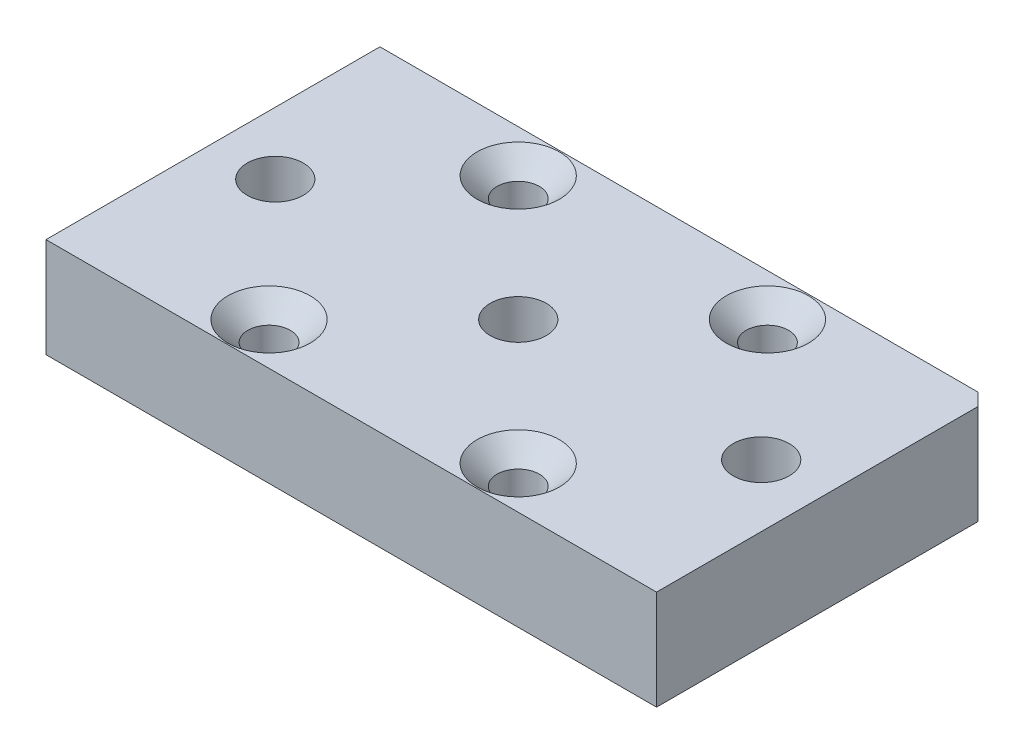
ISO-10303-21;
HEADER;
FILE_DESCRIPTION(('STEP AP214'),'2;1');
FILE_NAME('part.step','',(''),(''),'','','');
FILE_SCHEMA(('AUTOMOTIVE_DESIGN { 1 0 10303 214 1 1 1 1 }'));
ENDSEC;
DATA;
#1=APPLICATION_CONTEXT('core data for automotive mechanical design processes');
#2=APPLICATION_PROTOCOL_DEFINITION('international standard','automotive_design',2000,#1);
#3=PRODUCT_CONTEXT('',#1,'mechanical');
#4=PRODUCT('Part','Part','',(#3));
#5=PRODUCT_RELATED_PRODUCT_CATEGORY('part','',(#4));
#6=PRODUCT_DEFINITION_FORMATION('','',#4);
#7=PRODUCT_DEFINITION_CONTEXT('part definition',#1,'design');
#8=PRODUCT_DEFINITION('design','',#6,#7);
#9=PRODUCT_DEFINITION_SHAPE('','',#8);
#10=(LENGTH_UNIT() NAMED_UNIT(*) SI_UNIT(.MILLI.,.METRE.));
#11=(NAMED_UNIT(*) PLANE_ANGLE_UNIT() SI_UNIT($,.RADIAN.));
#12=(NAMED_UNIT(*) SI_UNIT($,.STERADIAN.) SOLID_ANGLE_UNIT());
#13=UNCERTAINTY_MEASURE_WITH_UNIT(LENGTH_MEASURE(1.E-05),#10,'distance_accuracy_value','');
#14=(GEOMETRIC_REPRESENTATION_CONTEXT(3) GLOBAL_UNCERTAINTY_ASSIGNED_CONTEXT((#13)) GLOBAL_UNIT_ASSIGNED_CONTEXT((#10,
#11,#12)) REPRESENTATION_CONTEXT('',''));
#15=CARTESIAN_POINT('',(0.,0.,0.));
#16=DIRECTION('',(0.,0.,1.));
#17=DIRECTION('',(1.,0.,0.));
#18=AXIS2_PLACEMENT_3D('',#15,#16,#17);
#19=CARTESIAN_POINT('',(24.5,8.,13.4));
#20=DIRECTION('',(-1.,0.,0.));
#21=DIRECTION('',(0.,0.,1.));
#22=AXIS2_PLACEMENT_3D('',#19,#20,#21);
#23=PLANE('',#22);
#24=DIRECTION('',(0.,0.,-1.));
#25=VECTOR('',#24,1.);
#26=CARTESIAN_POINT('',(24.5,0.,13.4));
#27=LINE('',#26,#25);
#28=CARTESIAN_POINT('',(24.5,0.,13.4));
#29=VERTEX_POINT('',#28);
#30=CARTESIAN_POINT('',(24.5,0.,-12.4));
#31=VERTEX_POINT('',#30);
#32=EDGE_CURVE('E118',#29,#31,#27,.T.);
#33=ORIENTED_EDGE('',*,*,#32,.T.);
#34=DIRECTION('',(0.,1.,0.));
#35=VECTOR('',#34,1.);
#36=CARTESIAN_POINT('',(24.5,8.,-12.4));
#37=LINE('',#36,#35);
#38=CARTESIAN_POINT('',(24.5,8.,-12.4));
#39=VERTEX_POINT('',#38);
#40=EDGE_CURVE('E50',#31,#39,#37,.T.);
#41=ORIENTED_EDGE('',*,*,#40,.T.);
#42=DIRECTION('',(0.,0.,-1.));
#43=VECTOR('',#42,1.);
#44=CARTESIAN_POINT('',(24.5,8.,13.4));
#45=LINE('',#44,#43);
#46=CARTESIAN_POINT('',(24.5,8.,13.4));
#47=VERTEX_POINT('',#46);
#48=EDGE_CURVE('E98',#47,#39,#45,.T.);
#49=ORIENTED_EDGE('',*,*,#48,.F.);
#50=DIRECTION('',(0.,-1.,0.));
#51=VECTOR('',#50,1.);
#52=CARTESIAN_POINT('',(24.5,8.,13.4));
#53=LINE('',#52,#51);
#54=EDGE_CURVE('E114',#47,#29,#53,.T.);
#55=ORIENTED_EDGE('',*,*,#54,.T.);
#56=EDGE_LOOP('',(#33,#41,#49,#55));
#57=FACE_BOUND('',#56,.T.);
#58=ADVANCED_FACE('F41',(#57),#23,.F.);
#59=CARTESIAN_POINT('',(-24.5,8.,-13.4));
#60=DIRECTION('',(0.,0.,1.));
#61=DIRECTION('',(1.,0.,0.));
#62=AXIS2_PLACEMENT_3D('',#59,#60,#61);
#63=PLANE('',#62);
#64=DIRECTION('',(-1.,0.,0.));
#65=VECTOR('',#64,1.);
#66=CARTESIAN_POINT('',(-24.5,8.,-13.4));
#67=LINE('',#66,#65);
#68=CARTESIAN_POINT('',(23.5,8.,-13.4));
#69=VERTEX_POINT('',#68);
#70=CARTESIAN_POINT('',(-24.5,8.,-13.4));
#71=VERTEX_POINT('',#70);
#72=EDGE_CURVE('E88',#69,#71,#67,.T.);
#73=ORIENTED_EDGE('',*,*,#72,.F.);
#74=DIRECTION('',(0.,-1.,0.));
#75=VECTOR('',#74,1.);
#76=CARTESIAN_POINT('',(23.5,8.,-13.4));
#77=LINE('',#76,#75);
#78=CARTESIAN_POINT('',(23.5,0.,-13.4));
#79=VERTEX_POINT('',#78);
#80=EDGE_CURVE('E106',#69,#79,#77,.T.);
#81=ORIENTED_EDGE('',*,*,#80,.T.);
#82=DIRECTION('',(-1.,0.,0.));
#83=VECTOR('',#82,1.);
#84=CARTESIAN_POINT('',(-24.5,0.,-13.4));
#85=LINE('',#84,#83);
#86=CARTESIAN_POINT('',(-24.5,0.,-13.4));
#87=VERTEX_POINT('',#86);
#88=EDGE_CURVE('E103',#79,#87,#85,.T.);
#89=ORIENTED_EDGE('',*,*,#88,.T.);
#90=DIRECTION('',(0.,-1.,0.));
#91=VECTOR('',#90,1.);
#92=CARTESIAN_POINT('',(-24.5,8.,-13.4));
#93=LINE('',#92,#91);
#94=EDGE_CURVE('E101',#71,#87,#93,.T.);
#95=ORIENTED_EDGE('',*,*,#94,.F.);
#96=EDGE_LOOP('',(#73,#81,#89,#95));
#97=FACE_BOUND('',#96,.T.);
#98=ADVANCED_FACE('F102',(#97),#63,.F.);
#99=CARTESIAN_POINT('',(-24.5,8.,13.4));
#100=DIRECTION('',(1.,0.,0.));
#101=DIRECTION('',(0.,0.,-1.));
#102=AXIS2_PLACEMENT_3D('',#99,#100,#101);
#103=PLANE('',#102);
#104=DIRECTION('',(0.,0.,1.));
#105=VECTOR('',#104,1.);
#106=CARTESIAN_POINT('',(-24.5,0.,13.4));
#107=LINE('',#106,#105);
#108=CARTESIAN_POINT('',(-24.5,0.,13.4));
#109=VERTEX_POINT('',#108);
#110=EDGE_CURVE('E122',#87,#109,#107,.T.);
#111=ORIENTED_EDGE('',*,*,#110,.T.);
#112=DIRECTION('',(0.,-1.,0.));
#113=VECTOR('',#112,1.);
#114=CARTESIAN_POINT('',(-24.5,8.,13.4));
#115=LINE('',#114,#113);
#116=CARTESIAN_POINT('',(-24.5,8.,13.4));
#117=VERTEX_POINT('',#116);
#118=EDGE_CURVE('E107',#117,#109,#115,.T.);
#119=ORIENTED_EDGE('',*,*,#118,.F.);
#120=DIRECTION('',(0.,0.,1.));
#121=VECTOR('',#120,1.);
#122=CARTESIAN_POINT('',(-24.5,8.,13.4));
#123=LINE('',#122,#121);
#124=EDGE_CURVE('E92',#71,#117,#123,.T.);
#125=ORIENTED_EDGE('',*,*,#124,.F.);
#126=ORIENTED_EDGE('',*,*,#94,.T.);
#127=EDGE_LOOP('',(#111,#119,#125,#126));
#128=FACE_BOUND('',#127,.T.);
#129=ADVANCED_FACE('F109',(#128),#103,.F.);
#130=CARTESIAN_POINT('',(-24.5,8.,13.4));
#131=DIRECTION('',(0.,0.,-1.));
#132=DIRECTION('',(-1.,0.,0.));
#133=AXIS2_PLACEMENT_3D('',#130,#131,#132);
#134=PLANE('',#133);
#135=DIRECTION('',(1.,0.,0.));
#136=VECTOR('',#135,1.);
#137=CARTESIAN_POINT('',(-24.5,0.,13.4));
#138=LINE('',#137,#136);
#139=EDGE_CURVE('E124',#109,#29,#138,.T.);
#140=ORIENTED_EDGE('',*,*,#139,.T.);
#141=ORIENTED_EDGE('',*,*,#54,.F.);
#142=DIRECTION('',(1.,0.,0.));
#143=VECTOR('',#142,1.);
#144=CARTESIAN_POINT('',(-24.5,8.,13.4));
#145=LINE('',#144,#143);
#146=EDGE_CURVE('E112',#117,#47,#145,.T.);
#147=ORIENTED_EDGE('',*,*,#146,.F.);
#148=ORIENTED_EDGE('',*,*,#118,.T.);
#149=EDGE_LOOP('',(#140,#141,#147,#148));
#150=FACE_BOUND('',#149,.T.);
#151=ADVANCED_FACE('F134',(#150),#134,.F.);
#152=CARTESIAN_POINT('',(0.,8.,0.));
#153=DIRECTION('',(0.,-1.,0.));
#154=DIRECTION('',(0.,0.,-1.));
#155=AXIS2_PLACEMENT_3D('',#152,#153,#154);
#156=PLANE('',#155);
#157=CARTESIAN_POINT('',(-19.5,8.,0.));
#158=DIRECTION('',(0.,-1.,0.));
#159=DIRECTION('',(0.,0.,-1.));
#160=AXIS2_PLACEMENT_3D('',#157,#158,#159);
#161=CIRCLE('',#160,2.25);
#162=CARTESIAN_POINT('',(-19.5,8.,-2.25));
#163=VERTEX_POINT('',#162);
#164=EDGE_CURVE('E215',#163,#163,#161,.T.);
#165=ORIENTED_EDGE('',*,*,#164,.T.);
#166=EDGE_LOOP('',(#165));
#167=FACE_BOUND('',#166,.T.);
#168=CARTESIAN_POINT('',(0.,8.,0.));
#169=DIRECTION('',(0.,-1.,0.));
#170=DIRECTION('',(0.,0.,-1.));
#171=AXIS2_PLACEMENT_3D('',#168,#169,#170);
#172=CIRCLE('',#171,2.25);
#173=CARTESIAN_POINT('',(0.,8.,-2.25));
#174=VERTEX_POINT('',#173);
#175=EDGE_CURVE('E231',#174,#174,#172,.T.);
#176=ORIENTED_EDGE('',*,*,#175,.T.);
#177=EDGE_LOOP('',(#176));
#178=FACE_BOUND('',#177,.T.);
#179=CARTESIAN_POINT('',(19.5,8.,0.));
#180=DIRECTION('',(0.,-1.,0.));
#181=DIRECTION('',(0.,0.,-1.));
#182=AXIS2_PLACEMENT_3D('',#179,#180,#181);
#183=CIRCLE('',#182,2.25);
#184=CARTESIAN_POINT('',(19.5,8.,-2.25));
#185=VERTEX_POINT('',#184);
#186=EDGE_CURVE('E240',#185,#185,#183,.T.);
#187=ORIENTED_EDGE('',*,*,#186,.T.);
#188=EDGE_LOOP('',(#187));
#189=FACE_BOUND('',#188,.T.);
#190=CARTESIAN_POINT('',(-10.,8.,10.));
#191=DIRECTION('',(0.,1.,0.));
#192=DIRECTION('',(0.,0.,1.));
#193=AXIS2_PLACEMENT_3D('',#190,#191,#192);
#194=CIRCLE('',#193,3.3);
#195=CARTESIAN_POINT('',(-10.,8.,13.3));
#196=VERTEX_POINT('',#195);
#197=EDGE_CURVE('E243',#196,#196,#194,.T.);
#198=ORIENTED_EDGE('',*,*,#197,.F.);
#199=EDGE_LOOP('',(#198));
#200=FACE_BOUND('',#199,.T.);
#201=CARTESIAN_POINT('',(9.99999999999999,8.,10.));
#202=DIRECTION('',(0.,1.,0.));
#203=DIRECTION('',(0.,0.,1.));
#204=AXIS2_PLACEMENT_3D('',#201,#202,#203);
#205=CIRCLE('',#204,3.3);
#206=CARTESIAN_POINT('',(9.99999999999999,8.,13.3));
#207=VERTEX_POINT('',#206);
#208=EDGE_CURVE('E252',#207,#207,#205,.T.);
#209=ORIENTED_EDGE('',*,*,#208,.F.);
#210=EDGE_LOOP('',(#209));
#211=FACE_BOUND('',#210,.T.);
#212=CARTESIAN_POINT('',(9.99999999999999,8.,-10.));
#213=DIRECTION('',(0.,1.,0.));
#214=DIRECTION('',(0.,0.,1.));
#215=AXIS2_PLACEMENT_3D('',#212,#213,#214);
#216=CIRCLE('',#215,3.3);
#217=CARTESIAN_POINT('',(9.99999999999999,8.,-6.7));
#218=VERTEX_POINT('',#217);
#219=EDGE_CURVE('E261',#218,#218,#216,.T.);
#220=ORIENTED_EDGE('',*,*,#219,.F.);
#221=EDGE_LOOP('',(#220));
#222=FACE_BOUND('',#221,.T.);
#223=CARTESIAN_POINT('',(-10.,8.,-10.));
#224=DIRECTION('',(0.,1.,0.));
#225=DIRECTION('',(0.,0.,1.));
#226=AXIS2_PLACEMENT_3D('',#223,#224,#225);
#227=CIRCLE('',#226,3.3);
#228=CARTESIAN_POINT('',(-10.,8.,-6.7));
#229=VERTEX_POINT('',#228);
#230=EDGE_CURVE('E270',#229,#229,#227,.T.);
#231=ORIENTED_EDGE('',*,*,#230,.F.);
#232=EDGE_LOOP('',(#231));
#233=FACE_BOUND('',#232,.T.);
#234=ORIENTED_EDGE('',*,*,#48,.T.);
#235=DIRECTION('',(0.707106781186548,0.,0.707106781186548));
#236=VECTOR('',#235,1.);
#237=CARTESIAN_POINT('',(23.5,8.,-13.4));
#238=LINE('',#237,#236);
#239=EDGE_CURVE('E11',#39,#69,#238,.F.);
#240=ORIENTED_EDGE('',*,*,#239,.T.);
#241=ORIENTED_EDGE('',*,*,#72,.T.);
#242=ORIENTED_EDGE('',*,*,#124,.T.);
#243=ORIENTED_EDGE('',*,*,#146,.T.);
#244=EDGE_LOOP('',(#234,#240,#241,#242,#243));
#245=FACE_BOUND('',#244,.T.);
#246=ADVANCED_FACE('F90',(#167,#178,#189,#200,#211,#222,#233,#245),#156,.F.);
#247=CARTESIAN_POINT('',(0.,0.,0.));
#248=DIRECTION('',(0.,-1.,0.));
#249=DIRECTION('',(0.,0.,-1.));
#250=AXIS2_PLACEMENT_3D('',#247,#248,#249);
#251=PLANE('',#250);
#252=CARTESIAN_POINT('',(-19.5,0.,0.));
#253=DIRECTION('',(0.,-1.,0.));
#254=DIRECTION('',(0.,0.,-1.));
#255=AXIS2_PLACEMENT_3D('',#252,#253,#254);
#256=CIRCLE('',#255,4.3);
#257=CARTESIAN_POINT('',(-19.5,0.,-4.3));
#258=VERTEX_POINT('',#257);
#259=EDGE_CURVE('E219',#258,#258,#256,.T.);
#260=ORIENTED_EDGE('',*,*,#259,.F.);
#261=EDGE_LOOP('',(#260));
#262=FACE_BOUND('',#261,.T.);
#263=CARTESIAN_POINT('',(0.,0.,0.));
#264=DIRECTION('',(0.,-1.,0.));
#265=DIRECTION('',(0.,0.,-1.));
#266=AXIS2_PLACEMENT_3D('',#263,#264,#265);
#267=CIRCLE('',#266,4.3);
#268=CARTESIAN_POINT('',(0.,0.,-4.3));
#269=VERTEX_POINT('',#268);
#270=EDGE_CURVE('E221',#269,#269,#267,.T.);
#271=ORIENTED_EDGE('',*,*,#270,.F.);
#272=EDGE_LOOP('',(#271));
#273=FACE_BOUND('',#272,.T.);
#274=CARTESIAN_POINT('',(19.5,0.,0.));
#275=DIRECTION('',(0.,-1.,0.));
#276=DIRECTION('',(0.,0.,-1.));
#277=AXIS2_PLACEMENT_3D('',#274,#275,#276);
#278=CIRCLE('',#277,4.3);
#279=CARTESIAN_POINT('',(19.5,0.,-4.3));
#280=VERTEX_POINT('',#279);
#281=EDGE_CURVE('E234',#280,#280,#278,.T.);
#282=ORIENTED_EDGE('',*,*,#281,.F.);
#283=EDGE_LOOP('',(#282));
#284=FACE_BOUND('',#283,.T.);
#285=CARTESIAN_POINT('',(-10.,0.,10.));
#286=DIRECTION('',(0.,1.,0.));
#287=DIRECTION('',(0.,0.,1.));
#288=AXIS2_PLACEMENT_3D('',#285,#286,#287);
#289=CIRCLE('',#288,1.7);
#290=CARTESIAN_POINT('',(-10.,0.,11.7));
#291=VERTEX_POINT('',#290);
#292=EDGE_CURVE('E249',#291,#291,#289,.T.);
#293=ORIENTED_EDGE('',*,*,#292,.T.);
#294=EDGE_LOOP('',(#293));
#295=FACE_BOUND('',#294,.T.);
#296=CARTESIAN_POINT('',(9.99999999999999,0.,10.));
#297=DIRECTION('',(0.,1.,0.));
#298=DIRECTION('',(0.,0.,1.));
#299=AXIS2_PLACEMENT_3D('',#296,#297,#298);
#300=CIRCLE('',#299,1.7);
#301=CARTESIAN_POINT('',(9.99999999999999,0.,11.7));
#302=VERTEX_POINT('',#301);
#303=EDGE_CURVE('E258',#302,#302,#300,.T.);
#304=ORIENTED_EDGE('',*,*,#303,.T.);
#305=EDGE_LOOP('',(#304));
#306=FACE_BOUND('',#305,.T.);
#307=CARTESIAN_POINT('',(9.99999999999999,0.,-10.));
#308=DIRECTION('',(0.,1.,0.));
#309=DIRECTION('',(0.,0.,1.));
#310=AXIS2_PLACEMENT_3D('',#307,#308,#309);
#311=CIRCLE('',#310,1.7);
#312=CARTESIAN_POINT('',(9.99999999999999,0.,-8.3));
#313=VERTEX_POINT('',#312);
#314=EDGE_CURVE('E267',#313,#313,#311,.T.);
#315=ORIENTED_EDGE('',*,*,#314,.T.);
#316=EDGE_LOOP('',(#315));
#317=FACE_BOUND('',#316,.T.);
#318=CARTESIAN_POINT('',(-10.,0.,-10.));
#319=DIRECTION('',(0.,1.,0.));
#320=DIRECTION('',(0.,0.,1.));
#321=AXIS2_PLACEMENT_3D('',#318,#319,#320);
#322=CIRCLE('',#321,1.7);
#323=CARTESIAN_POINT('',(-10.,0.,-8.3));
#324=VERTEX_POINT('',#323);
#325=EDGE_CURVE('E120',#324,#324,#322,.T.);
#326=ORIENTED_EDGE('',*,*,#325,.T.);
#327=EDGE_LOOP('',(#326));
#328=FACE_BOUND('',#327,.T.);
#329=ORIENTED_EDGE('',*,*,#88,.F.);
#330=DIRECTION('',(-0.707106781186548,0.,-0.707106781186548));
#331=VECTOR('',#330,1.);
#332=CARTESIAN_POINT('',(18.45,0.,-18.45));
#333=LINE('',#332,#331);
#334=EDGE_CURVE('E64',#79,#31,#333,.F.);
#335=ORIENTED_EDGE('',*,*,#334,.T.);
#336=ORIENTED_EDGE('',*,*,#32,.F.);
#337=ORIENTED_EDGE('',*,*,#139,.F.);
#338=ORIENTED_EDGE('',*,*,#110,.F.);
#339=EDGE_LOOP('',(#329,#335,#336,#337,#338));
#340=FACE_BOUND('',#339,.T.);
#341=ADVANCED_FACE('F131',(#262,#273,#284,#295,#306,#317,#328,#340),#251,.T.);
#342=CARTESIAN_POINT('',(-10.,8.,-10.));
#343=DIRECTION('',(0.,1.,0.));
#344=DIRECTION('',(0.,0.,1.));
#345=AXIS2_PLACEMENT_3D('',#342,#343,#344);
#346=CYLINDRICAL_SURFACE('',#345,1.7);
#347=ORIENTED_EDGE('',*,*,#325,.F.);
#348=EDGE_LOOP('',(#347));
#349=FACE_BOUND('',#348,.T.);
#350=CARTESIAN_POINT('',(-10.,6.4,-10.));
#351=DIRECTION('',(0.,1.,0.));
#352=DIRECTION('',(0.,0.,1.));
#353=AXIS2_PLACEMENT_3D('',#350,#351,#352);
#354=CIRCLE('',#353,1.7);
#355=CARTESIAN_POINT('',(-10.,6.4,-8.3));
#356=VERTEX_POINT('',#355);
#357=EDGE_CURVE('E273',#356,#356,#354,.T.);
#358=ORIENTED_EDGE('',*,*,#357,.T.);
#359=EDGE_LOOP('',(#358));
#360=FACE_BOUND('',#359,.T.);
#361=ADVANCED_FACE('F156',(#349,#360),#346,.F.);
#362=CARTESIAN_POINT('',(-10.,8.,-10.));
#363=DIRECTION('',(0.,1.,0.));
#364=DIRECTION('',(0.,0.,1.));
#365=AXIS2_PLACEMENT_3D('',#362,#363,#364);
#366=CONICAL_SURFACE('',#365,3.3,0.785398163397449);
#367=ORIENTED_EDGE('',*,*,#357,.F.);
#368=EDGE_LOOP('',(#367));
#369=FACE_BOUND('',#368,.T.);
#370=ORIENTED_EDGE('',*,*,#230,.T.);
#371=EDGE_LOOP('',(#370));
#372=FACE_BOUND('',#371,.T.);
#373=ADVANCED_FACE('F163',(#369,#372),#366,.F.);
#374=CARTESIAN_POINT('',(9.99999999999999,8.,-10.));
#375=DIRECTION('',(0.,1.,0.));
#376=DIRECTION('',(0.,0.,1.));
#377=AXIS2_PLACEMENT_3D('',#374,#375,#376);
#378=CYLINDRICAL_SURFACE('',#377,1.7);
#379=ORIENTED_EDGE('',*,*,#314,.F.);
#380=EDGE_LOOP('',(#379));
#381=FACE_BOUND('',#380,.T.);
#382=CARTESIAN_POINT('',(9.99999999999999,6.4,-10.));
#383=DIRECTION('',(0.,1.,0.));
#384=DIRECTION('',(0.,0.,1.));
#385=AXIS2_PLACEMENT_3D('',#382,#383,#384);
#386=CIRCLE('',#385,1.7);
#387=CARTESIAN_POINT('',(9.99999999999999,6.4,-8.3));
#388=VERTEX_POINT('',#387);
#389=EDGE_CURVE('E264',#388,#388,#386,.T.);
#390=ORIENTED_EDGE('',*,*,#389,.T.);
#391=EDGE_LOOP('',(#390));
#392=FACE_BOUND('',#391,.T.);
#393=ADVANCED_FACE('F167',(#381,#392),#378,.F.);
#394=CARTESIAN_POINT('',(9.99999999999999,8.,-10.));
#395=DIRECTION('',(0.,1.,0.));
#396=DIRECTION('',(0.,0.,1.));
#397=AXIS2_PLACEMENT_3D('',#394,#395,#396);
#398=CONICAL_SURFACE('',#397,3.3,0.785398163397449);
#399=ORIENTED_EDGE('',*,*,#389,.F.);
#400=EDGE_LOOP('',(#399));
#401=FACE_BOUND('',#400,.T.);
#402=ORIENTED_EDGE('',*,*,#219,.T.);
#403=EDGE_LOOP('',(#402));
#404=FACE_BOUND('',#403,.T.);
#405=ADVANCED_FACE('F171',(#401,#404),#398,.F.);
#406=CARTESIAN_POINT('',(9.99999999999999,8.,10.));
#407=DIRECTION('',(0.,1.,0.));
#408=DIRECTION('',(0.,0.,1.));
#409=AXIS2_PLACEMENT_3D('',#406,#407,#408);
#410=CYLINDRICAL_SURFACE('',#409,1.7);
#411=ORIENTED_EDGE('',*,*,#303,.F.);
#412=EDGE_LOOP('',(#411));
#413=FACE_BOUND('',#412,.T.);
#414=CARTESIAN_POINT('',(9.99999999999999,6.4,10.));
#415=DIRECTION('',(0.,1.,0.));
#416=DIRECTION('',(0.,0.,1.));
#417=AXIS2_PLACEMENT_3D('',#414,#415,#416);
#418=CIRCLE('',#417,1.7);
#419=CARTESIAN_POINT('',(9.99999999999999,6.4,11.7));
#420=VERTEX_POINT('',#419);
#421=EDGE_CURVE('E255',#420,#420,#418,.T.);
#422=ORIENTED_EDGE('',*,*,#421,.T.);
#423=EDGE_LOOP('',(#422));
#424=FACE_BOUND('',#423,.T.);
#425=ADVANCED_FACE('F175',(#413,#424),#410,.F.);
#426=CARTESIAN_POINT('',(9.99999999999999,8.,10.));
#427=DIRECTION('',(0.,1.,0.));
#428=DIRECTION('',(0.,0.,1.));
#429=AXIS2_PLACEMENT_3D('',#426,#427,#428);
#430=CONICAL_SURFACE('',#429,3.3,0.785398163397449);
#431=ORIENTED_EDGE('',*,*,#421,.F.);
#432=EDGE_LOOP('',(#431));
#433=FACE_BOUND('',#432,.T.);
#434=ORIENTED_EDGE('',*,*,#208,.T.);
#435=EDGE_LOOP('',(#434));
#436=FACE_BOUND('',#435,.T.);
#437=ADVANCED_FACE('F179',(#433,#436),#430,.F.);
#438=CARTESIAN_POINT('',(-10.,8.,10.));
#439=DIRECTION('',(0.,1.,0.));
#440=DIRECTION('',(0.,0.,1.));
#441=AXIS2_PLACEMENT_3D('',#438,#439,#440);
#442=CYLINDRICAL_SURFACE('',#441,1.7);
#443=ORIENTED_EDGE('',*,*,#292,.F.);
#444=EDGE_LOOP('',(#443));
#445=FACE_BOUND('',#444,.T.);
#446=CARTESIAN_POINT('',(-10.,6.4,10.));
#447=DIRECTION('',(0.,1.,0.));
#448=DIRECTION('',(0.,0.,1.));
#449=AXIS2_PLACEMENT_3D('',#446,#447,#448);
#450=CIRCLE('',#449,1.7);
#451=CARTESIAN_POINT('',(-10.,6.4,11.7));
#452=VERTEX_POINT('',#451);
#453=EDGE_CURVE('E246',#452,#452,#450,.T.);
#454=ORIENTED_EDGE('',*,*,#453,.T.);
#455=EDGE_LOOP('',(#454));
#456=FACE_BOUND('',#455,.T.);
#457=ADVANCED_FACE('F183',(#445,#456),#442,.F.);
#458=CARTESIAN_POINT('',(-10.,8.,10.));
#459=DIRECTION('',(0.,1.,0.));
#460=DIRECTION('',(0.,0.,1.));
#461=AXIS2_PLACEMENT_3D('',#458,#459,#460);
#462=CONICAL_SURFACE('',#461,3.3,0.785398163397449);
#463=ORIENTED_EDGE('',*,*,#453,.F.);
#464=EDGE_LOOP('',(#463));
#465=FACE_BOUND('',#464,.T.);
#466=ORIENTED_EDGE('',*,*,#197,.T.);
#467=EDGE_LOOP('',(#466));
#468=FACE_BOUND('',#467,.T.);
#469=ADVANCED_FACE('F187',(#465,#468),#462,.F.);
#470=CARTESIAN_POINT('',(19.5,0.,0.));
#471=DIRECTION('',(0.,-1.,0.));
#472=DIRECTION('',(0.,0.,-1.));
#473=AXIS2_PLACEMENT_3D('',#470,#471,#472);
#474=CYLINDRICAL_SURFACE('',#473,2.25);
#475=ORIENTED_EDGE('',*,*,#186,.F.);
#476=EDGE_LOOP('',(#475));
#477=FACE_BOUND('',#476,.T.);
#478=CARTESIAN_POINT('',(19.5,2.05,0.));
#479=DIRECTION('',(0.,-1.,0.));
#480=DIRECTION('',(0.,0.,-1.));
#481=AXIS2_PLACEMENT_3D('',#478,#479,#480);
#482=CIRCLE('',#481,2.25);
#483=CARTESIAN_POINT('',(19.5,2.05,-2.25));
#484=VERTEX_POINT('',#483);
#485=EDGE_CURVE('E237',#484,#484,#482,.T.);
#486=ORIENTED_EDGE('',*,*,#485,.T.);
#487=EDGE_LOOP('',(#486));
#488=FACE_BOUND('',#487,.T.);
#489=ADVANCED_FACE('F191',(#477,#488),#474,.F.);
#490=CARTESIAN_POINT('',(19.5,0.,0.));
#491=DIRECTION('',(0.,-1.,0.));
#492=DIRECTION('',(0.,0.,-1.));
#493=AXIS2_PLACEMENT_3D('',#490,#491,#492);
#494=CONICAL_SURFACE('',#493,4.3,0.785398163397449);
#495=ORIENTED_EDGE('',*,*,#485,.F.);
#496=EDGE_LOOP('',(#495));
#497=FACE_BOUND('',#496,.T.);
#498=ORIENTED_EDGE('',*,*,#281,.T.);
#499=EDGE_LOOP('',(#498));
#500=FACE_BOUND('',#499,.T.);
#501=ADVANCED_FACE('F195',(#497,#500),#494,.F.);
#502=CARTESIAN_POINT('',(0.,0.,0.));
#503=DIRECTION('',(0.,-1.,0.));
#504=DIRECTION('',(0.,0.,-1.));
#505=AXIS2_PLACEMENT_3D('',#502,#503,#504);
#506=CYLINDRICAL_SURFACE('',#505,2.25);
#507=ORIENTED_EDGE('',*,*,#175,.F.);
#508=EDGE_LOOP('',(#507));
#509=FACE_BOUND('',#508,.T.);
#510=CARTESIAN_POINT('',(0.,2.05,0.));
#511=DIRECTION('',(0.,-1.,0.));
#512=DIRECTION('',(0.,0.,-1.));
#513=AXIS2_PLACEMENT_3D('',#510,#511,#512);
#514=CIRCLE('',#513,2.25);
#515=CARTESIAN_POINT('',(0.,2.05,-2.25));
#516=VERTEX_POINT('',#515);
#517=EDGE_CURVE('E228',#516,#516,#514,.T.);
#518=ORIENTED_EDGE('',*,*,#517,.T.);
#519=EDGE_LOOP('',(#518));
#520=FACE_BOUND('',#519,.T.);
#521=ADVANCED_FACE('F199',(#509,#520),#506,.F.);
#522=CARTESIAN_POINT('',(0.,0.,0.));
#523=DIRECTION('',(0.,-1.,0.));
#524=DIRECTION('',(0.,0.,-1.));
#525=AXIS2_PLACEMENT_3D('',#522,#523,#524);
#526=CONICAL_SURFACE('',#525,4.3,0.785398163397449);
#527=ORIENTED_EDGE('',*,*,#517,.F.);
#528=EDGE_LOOP('',(#527));
#529=FACE_BOUND('',#528,.T.);
#530=ORIENTED_EDGE('',*,*,#270,.T.);
#531=EDGE_LOOP('',(#530));
#532=FACE_BOUND('',#531,.T.);
#533=ADVANCED_FACE('F203',(#529,#532),#526,.F.);
#534=CARTESIAN_POINT('',(-19.5,0.,0.));
#535=DIRECTION('',(0.,-1.,0.));
#536=DIRECTION('',(0.,0.,-1.));
#537=AXIS2_PLACEMENT_3D('',#534,#535,#536);
#538=CYLINDRICAL_SURFACE('',#537,2.25);
#539=ORIENTED_EDGE('',*,*,#164,.F.);
#540=EDGE_LOOP('',(#539));
#541=FACE_BOUND('',#540,.T.);
#542=CARTESIAN_POINT('',(-19.5,2.05,0.));
#543=DIRECTION('',(0.,-1.,0.));
#544=DIRECTION('',(0.,0.,-1.));
#545=AXIS2_PLACEMENT_3D('',#542,#543,#544);
#546=CIRCLE('',#545,2.25);
#547=CARTESIAN_POINT('',(-19.5,2.05,-2.25));
#548=VERTEX_POINT('',#547);
#549=EDGE_CURVE('E218',#548,#548,#546,.T.);
#550=ORIENTED_EDGE('',*,*,#549,.T.);
#551=EDGE_LOOP('',(#550));
#552=FACE_BOUND('',#551,.T.);
#553=ADVANCED_FACE('F141',(#541,#552),#538,.F.);
#554=CARTESIAN_POINT('',(-19.5,0.,0.));
#555=DIRECTION('',(0.,-1.,0.));
#556=DIRECTION('',(0.,0.,-1.));
#557=AXIS2_PLACEMENT_3D('',#554,#555,#556);
#558=CONICAL_SURFACE('',#557,4.3,0.785398163397449);
#559=ORIENTED_EDGE('',*,*,#549,.F.);
#560=EDGE_LOOP('',(#559));
#561=FACE_BOUND('',#560,.T.);
#562=ORIENTED_EDGE('',*,*,#259,.T.);
#563=EDGE_LOOP('',(#562));
#564=FACE_BOUND('',#563,.T.);
#565=ADVANCED_FACE('F137',(#561,#564),#558,.F.);
#566=CARTESIAN_POINT('',(23.5,8.,-13.4));
#567=DIRECTION('',(-0.707106781186547,0.,0.707106781186547));
#568=DIRECTION('',(0.,-1.,0.));
#569=AXIS2_PLACEMENT_3D('',#566,#567,#568);
#570=PLANE('',#569);
#571=ORIENTED_EDGE('',*,*,#239,.F.);
#572=ORIENTED_EDGE('',*,*,#40,.F.);
#573=ORIENTED_EDGE('',*,*,#334,.F.);
#574=ORIENTED_EDGE('',*,*,#80,.F.);
#575=EDGE_LOOP('',(#571,#572,#573,#574));
#576=FACE_BOUND('',#575,.T.);
#577=ADVANCED_FACE('F44',(#576),#570,.F.);
#578=CLOSED_SHELL('',(#58,#98,#129,#151,#246,#341,#361,#373,#393,#405,#425,#437,#457,#469,#489,
#501,#521,#533,#553,#565,#577));
#579=MANIFOLD_SOLID_BREP('B2',#578);
#580=ADVANCED_BREP_SHAPE_REPRESENTATION('',(#18,#579),#14);
#581=SHAPE_DEFINITION_REPRESENTATION(#9,#580);
ENDSEC;
END-ISO-10303-21;
